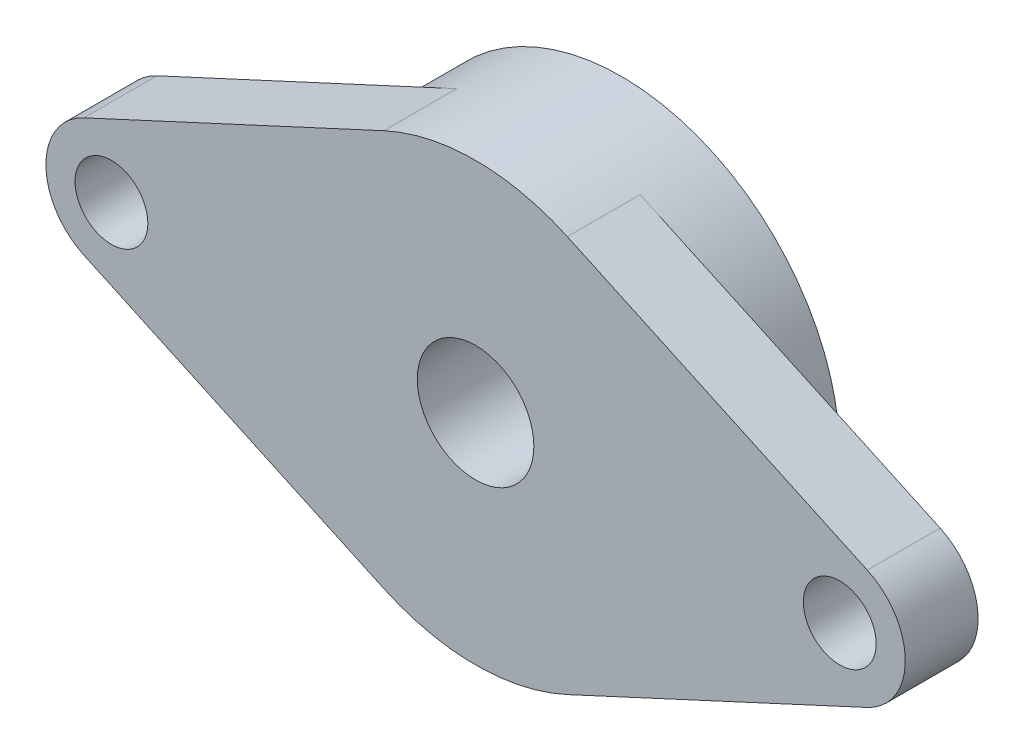
ISO-10303-21;
HEADER;
FILE_DESCRIPTION(('STEP AP214'),'2;1');
FILE_NAME('part.step','',(''),(''),'','','');
FILE_SCHEMA(('AUTOMOTIVE_DESIGN { 1 0 10303 214 1 1 1 1 }'));
ENDSEC;
DATA;
#1=APPLICATION_CONTEXT('core data for automotive mechanical design processes');
#2=APPLICATION_PROTOCOL_DEFINITION('international standard','automotive_design',2000,#1);
#3=PRODUCT_CONTEXT('',#1,'mechanical');
#4=PRODUCT('Part','Part','',(#3));
#5=PRODUCT_RELATED_PRODUCT_CATEGORY('part','',(#4));
#6=PRODUCT_DEFINITION_FORMATION('','',#4);
#7=PRODUCT_DEFINITION_CONTEXT('part definition',#1,'design');
#8=PRODUCT_DEFINITION('design','',#6,#7);
#9=PRODUCT_DEFINITION_SHAPE('','',#8);
#10=(LENGTH_UNIT() NAMED_UNIT(*) SI_UNIT(.MILLI.,.METRE.));
#11=(NAMED_UNIT(*) PLANE_ANGLE_UNIT() SI_UNIT($,.RADIAN.));
#12=(NAMED_UNIT(*) SI_UNIT($,.STERADIAN.) SOLID_ANGLE_UNIT());
#13=UNCERTAINTY_MEASURE_WITH_UNIT(LENGTH_MEASURE(1.E-05),#10,'distance_accuracy_value','');
#14=(GEOMETRIC_REPRESENTATION_CONTEXT(3) GLOBAL_UNCERTAINTY_ASSIGNED_CONTEXT((#13)) GLOBAL_UNIT_ASSIGNED_CONTEXT((#10,
#11,#12)) REPRESENTATION_CONTEXT('',''));
#15=CARTESIAN_POINT('',(0.,0.,0.));
#16=DIRECTION('',(0.,0.,1.));
#17=DIRECTION('',(1.,0.,0.));
#18=AXIS2_PLACEMENT_3D('',#15,#16,#17);
#19=CARTESIAN_POINT('',(0.,0.,0.));
#20=DIRECTION('',(0.,0.,1.));
#21=DIRECTION('',(1.,0.,0.));
#22=AXIS2_PLACEMENT_3D('',#19,#20,#21);
#23=PLANE('',#22);
#24=CARTESIAN_POINT('',(0.,0.,0.));
#25=DIRECTION('',(0.,0.,-1.));
#26=DIRECTION('',(-1.,0.,0.));
#27=AXIS2_PLACEMENT_3D('',#24,#25,#26);
#28=CIRCLE('',#27,15.);
#29=CARTESIAN_POINT('',(6.3,13.6128615654461,0.));
#30=VERTEX_POINT('',#29);
#31=CARTESIAN_POINT('',(6.3,-13.6128615654461,0.));
#32=VERTEX_POINT('',#31);
#33=EDGE_CURVE('E11',#30,#32,#28,.T.);
#34=ORIENTED_EDGE('',*,*,#33,.F.);
#35=DIRECTION('',(-0.907524104363074,0.42,0.));
#36=VECTOR('',#35,1.);
#37=CARTESIAN_POINT('',(6.3,13.6128615654461,0.));
#38=LINE('',#37,#36);
#39=CARTESIAN_POINT('',(26.89,4.08385846963383,0.));
#40=VERTEX_POINT('',#39);
#41=EDGE_CURVE('E154',#40,#30,#38,.T.);
#42=ORIENTED_EDGE('',*,*,#41,.F.);
#43=CARTESIAN_POINT('',(25.,0.,0.));
#44=DIRECTION('',(0.,0.,1.));
#45=DIRECTION('',(1.,0.,0.));
#46=AXIS2_PLACEMENT_3D('',#43,#44,#45);
#47=CIRCLE('',#46,4.5);
#48=CARTESIAN_POINT('',(26.89,-4.08385846963383,0.));
#49=VERTEX_POINT('',#48);
#50=EDGE_CURVE('E113',#40,#49,#47,.F.);
#51=ORIENTED_EDGE('',*,*,#50,.T.);
#52=DIRECTION('',(-0.907524104363074,-0.42,0.));
#53=VECTOR('',#52,1.);
#54=CARTESIAN_POINT('',(6.29999999999999,-13.6128615654461,0.));
#55=LINE('',#54,#53);
#56=EDGE_CURVE('E151',#49,#32,#55,.T.);
#57=ORIENTED_EDGE('',*,*,#56,.T.);
#58=EDGE_LOOP('',(#34,#42,#51,#57));
#59=FACE_BOUND('',#58,.T.);
#60=CARTESIAN_POINT('',(25.,0.,0.));
#61=DIRECTION('',(0.,0.,1.));
#62=DIRECTION('',(1.,0.,0.));
#63=AXIS2_PLACEMENT_3D('',#60,#61,#62);
#64=CIRCLE('',#63,2.5);
#65=CARTESIAN_POINT('',(27.5,0.,0.));
#66=VERTEX_POINT('',#65);
#67=EDGE_CURVE('E159',#66,#66,#64,.F.);
#68=ORIENTED_EDGE('',*,*,#67,.F.);
#69=EDGE_LOOP('',(#68));
#70=FACE_BOUND('',#69,.T.);
#71=ADVANCED_FACE('F35',(#59,#70),#23,.F.);
#72=CARTESIAN_POINT('',(-6.3,13.6128615654461,5.));
#73=DIRECTION('',(-0.42,0.907524104363074,0.));
#74=DIRECTION('',(-0.907524104363074,-0.42,0.));
#75=AXIS2_PLACEMENT_3D('',#72,#73,#74);
#76=PLANE('',#75);
#77=DIRECTION('',(0.907524104363074,0.42,0.));
#78=VECTOR('',#77,1.);
#79=CARTESIAN_POINT('',(-6.3,13.6128615654461,0.));
#80=LINE('',#79,#78);
#81=CARTESIAN_POINT('',(-26.89,4.08385846963383,0.));
#82=VERTEX_POINT('',#81);
#83=CARTESIAN_POINT('',(-6.3,13.6128615654461,0.));
#84=VERTEX_POINT('',#83);
#85=EDGE_CURVE('E142',#82,#84,#80,.T.);
#86=ORIENTED_EDGE('',*,*,#85,.F.);
#87=DIRECTION('',(0.,0.,-1.));
#88=VECTOR('',#87,1.);
#89=CARTESIAN_POINT('',(-26.89,4.08385846963383,5.));
#90=LINE('',#89,#88);
#91=CARTESIAN_POINT('',(-26.89,4.08385846963383,5.));
#92=VERTEX_POINT('',#91);
#93=EDGE_CURVE('E39',#92,#82,#90,.T.);
#94=ORIENTED_EDGE('',*,*,#93,.F.);
#95=DIRECTION('',(0.907524104363074,0.42,0.));
#96=VECTOR('',#95,1.);
#97=CARTESIAN_POINT('',(-6.3,13.6128615654461,5.));
#98=LINE('',#97,#96);
#99=CARTESIAN_POINT('',(-6.3,13.6128615654461,5.));
#100=VERTEX_POINT('',#99);
#101=EDGE_CURVE('E162',#92,#100,#98,.T.);
#102=ORIENTED_EDGE('',*,*,#101,.T.);
#103=DIRECTION('',(0.,0.,-1.));
#104=VECTOR('',#103,1.);
#105=CARTESIAN_POINT('',(-6.3,13.6128615654461,5.));
#106=LINE('',#105,#104);
#107=EDGE_CURVE('E141',#100,#84,#106,.T.);
#108=ORIENTED_EDGE('',*,*,#107,.T.);
#109=EDGE_LOOP('',(#86,#94,#102,#108));
#110=FACE_BOUND('',#109,.T.);
#111=ADVANCED_FACE('F37',(#110),#76,.T.);
#112=CARTESIAN_POINT('',(-25.,0.,5.));
#113=DIRECTION('',(0.,0.,-1.));
#114=DIRECTION('',(-1.,0.,0.));
#115=AXIS2_PLACEMENT_3D('',#112,#113,#114);
#116=CYLINDRICAL_SURFACE('',#115,4.5);
#117=CARTESIAN_POINT('',(-25.,0.,0.));
#118=DIRECTION('',(0.,0.,1.));
#119=DIRECTION('',(1.,0.,0.));
#120=AXIS2_PLACEMENT_3D('',#117,#118,#119);
#121=CIRCLE('',#120,4.5);
#122=CARTESIAN_POINT('',(-26.89,-4.08385846963383,0.));
#123=VERTEX_POINT('',#122);
#124=EDGE_CURVE('E145',#82,#123,#121,.T.);
#125=ORIENTED_EDGE('',*,*,#124,.T.);
#126=DIRECTION('',(0.,0.,-1.));
#127=VECTOR('',#126,1.);
#128=CARTESIAN_POINT('',(-26.89,-4.08385846963383,5.));
#129=LINE('',#128,#127);
#130=CARTESIAN_POINT('',(-26.89,-4.08385846963383,5.));
#131=VERTEX_POINT('',#130);
#132=EDGE_CURVE('E171',#131,#123,#129,.T.);
#133=ORIENTED_EDGE('',*,*,#132,.F.);
#134=CARTESIAN_POINT('',(-25.,0.,5.));
#135=DIRECTION('',(0.,0.,1.));
#136=DIRECTION('',(1.,0.,0.));
#137=AXIS2_PLACEMENT_3D('',#134,#135,#136);
#138=CIRCLE('',#137,4.5);
#139=EDGE_CURVE('E185',#92,#131,#138,.T.);
#140=ORIENTED_EDGE('',*,*,#139,.F.);
#141=ORIENTED_EDGE('',*,*,#93,.T.);
#142=EDGE_LOOP('',(#125,#133,#140,#141));
#143=FACE_BOUND('',#142,.T.);
#144=ADVANCED_FACE('F197',(#143),#116,.T.);
#145=CARTESIAN_POINT('',(-6.29999999999999,-13.6128615654461,5.));
#146=DIRECTION('',(0.42,0.907524104363074,0.));
#147=DIRECTION('',(-0.907524104363074,0.42,0.));
#148=AXIS2_PLACEMENT_3D('',#145,#146,#147);
#149=PLANE('',#148);
#150=DIRECTION('',(0.907524104363074,-0.42,0.));
#151=VECTOR('',#150,1.);
#152=CARTESIAN_POINT('',(-6.29999999999999,-13.6128615654461,0.));
#153=LINE('',#152,#151);
#154=CARTESIAN_POINT('',(-6.3,-13.6128615654461,0.));
#155=VERTEX_POINT('',#154);
#156=EDGE_CURVE('E148',#123,#155,#153,.T.);
#157=ORIENTED_EDGE('',*,*,#156,.T.);
#158=DIRECTION('',(0.,0.,-1.));
#159=VECTOR('',#158,1.);
#160=CARTESIAN_POINT('',(-6.3,-13.6128615654461,5.));
#161=LINE('',#160,#159);
#162=CARTESIAN_POINT('',(-6.3,-13.6128615654461,5.));
#163=VERTEX_POINT('',#162);
#164=EDGE_CURVE('E169',#163,#155,#161,.T.);
#165=ORIENTED_EDGE('',*,*,#164,.F.);
#166=DIRECTION('',(0.907524104363074,-0.42,0.));
#167=VECTOR('',#166,1.);
#168=CARTESIAN_POINT('',(-6.29999999999999,-13.6128615654461,5.));
#169=LINE('',#168,#167);
#170=EDGE_CURVE('E187',#131,#163,#169,.T.);
#171=ORIENTED_EDGE('',*,*,#170,.F.);
#172=ORIENTED_EDGE('',*,*,#132,.T.);
#173=EDGE_LOOP('',(#157,#165,#171,#172));
#174=FACE_BOUND('',#173,.T.);
#175=ADVANCED_FACE('F198',(#174),#149,.F.);
#176=CARTESIAN_POINT('',(6.29999999999999,-13.6128615654461,5.));
#177=DIRECTION('',(0.42,-0.907524104363074,0.));
#178=DIRECTION('',(0.907524104363074,0.42,0.));
#179=AXIS2_PLACEMENT_3D('',#176,#177,#178);
#180=PLANE('',#179);
#181=ORIENTED_EDGE('',*,*,#56,.F.);
#182=DIRECTION('',(0.,0.,-1.));
#183=VECTOR('',#182,1.);
#184=CARTESIAN_POINT('',(26.89,-4.08385846963383,5.));
#185=LINE('',#184,#183);
#186=CARTESIAN_POINT('',(26.89,-4.08385846963383,5.));
#187=VERTEX_POINT('',#186);
#188=EDGE_CURVE('E114',#187,#49,#185,.T.);
#189=ORIENTED_EDGE('',*,*,#188,.F.);
#190=DIRECTION('',(-0.907524104363074,-0.42,0.));
#191=VECTOR('',#190,1.);
#192=CARTESIAN_POINT('',(6.29999999999999,-13.6128615654461,5.));
#193=LINE('',#192,#191);
#194=CARTESIAN_POINT('',(6.3,-13.6128615654461,5.));
#195=VERTEX_POINT('',#194);
#196=EDGE_CURVE('E126',#187,#195,#193,.T.);
#197=ORIENTED_EDGE('',*,*,#196,.T.);
#198=DIRECTION('',(0.,0.,-1.));
#199=VECTOR('',#198,1.);
#200=CARTESIAN_POINT('',(6.3,-13.6128615654461,5.));
#201=LINE('',#200,#199);
#202=EDGE_CURVE('E167',#195,#32,#201,.T.);
#203=ORIENTED_EDGE('',*,*,#202,.T.);
#204=EDGE_LOOP('',(#181,#189,#197,#203));
#205=FACE_BOUND('',#204,.T.);
#206=ADVANCED_FACE('F195',(#205),#180,.T.);
#207=CARTESIAN_POINT('',(25.,0.,5.));
#208=DIRECTION('',(0.,0.,-1.));
#209=DIRECTION('',(-1.,0.,0.));
#210=AXIS2_PLACEMENT_3D('',#207,#208,#209);
#211=CYLINDRICAL_SURFACE('',#210,4.5);
#212=ORIENTED_EDGE('',*,*,#50,.F.);
#213=DIRECTION('',(0.,0.,-1.));
#214=VECTOR('',#213,1.);
#215=CARTESIAN_POINT('',(26.89,4.08385846963383,5.));
#216=LINE('',#215,#214);
#217=CARTESIAN_POINT('',(26.89,4.08385846963383,5.));
#218=VERTEX_POINT('',#217);
#219=EDGE_CURVE('E81',#218,#40,#216,.T.);
#220=ORIENTED_EDGE('',*,*,#219,.F.);
#221=CARTESIAN_POINT('',(25.,0.,5.));
#222=DIRECTION('',(0.,0.,1.));
#223=DIRECTION('',(1.,0.,0.));
#224=AXIS2_PLACEMENT_3D('',#221,#222,#223);
#225=CIRCLE('',#224,4.5);
#226=EDGE_CURVE('E111',#218,#187,#225,.F.);
#227=ORIENTED_EDGE('',*,*,#226,.T.);
#228=ORIENTED_EDGE('',*,*,#188,.T.);
#229=EDGE_LOOP('',(#212,#220,#227,#228));
#230=FACE_BOUND('',#229,.T.);
#231=ADVANCED_FACE('F109',(#230),#211,.T.);
#232=CARTESIAN_POINT('',(6.3,13.6128615654461,5.));
#233=DIRECTION('',(-0.42,-0.907524104363074,0.));
#234=DIRECTION('',(0.907524104363074,-0.42,0.));
#235=AXIS2_PLACEMENT_3D('',#232,#233,#234);
#236=PLANE('',#235);
#237=ORIENTED_EDGE('',*,*,#41,.T.);
#238=DIRECTION('',(0.,0.,-1.));
#239=VECTOR('',#238,1.);
#240=CARTESIAN_POINT('',(6.3,13.6128615654461,5.));
#241=LINE('',#240,#239);
#242=CARTESIAN_POINT('',(6.3,13.6128615654461,5.));
#243=VERTEX_POINT('',#242);
#244=EDGE_CURVE('E115',#243,#30,#241,.T.);
#245=ORIENTED_EDGE('',*,*,#244,.F.);
#246=DIRECTION('',(-0.907524104363074,0.42,0.));
#247=VECTOR('',#246,1.);
#248=CARTESIAN_POINT('',(6.3,13.6128615654461,5.));
#249=LINE('',#248,#247);
#250=EDGE_CURVE('E118',#218,#243,#249,.T.);
#251=ORIENTED_EDGE('',*,*,#250,.F.);
#252=ORIENTED_EDGE('',*,*,#219,.T.);
#253=EDGE_LOOP('',(#237,#245,#251,#252));
#254=FACE_BOUND('',#253,.T.);
#255=ADVANCED_FACE('F119',(#254),#236,.F.);
#256=CARTESIAN_POINT('',(-25.,0.,5.));
#257=DIRECTION('',(0.,0.,-1.));
#258=DIRECTION('',(-1.,0.,0.));
#259=AXIS2_PLACEMENT_3D('',#256,#257,#258);
#260=CYLINDRICAL_SURFACE('',#259,2.5);
#261=CARTESIAN_POINT('',(-25.,0.,5.));
#262=DIRECTION('',(0.,0.,1.));
#263=DIRECTION('',(1.,0.,0.));
#264=AXIS2_PLACEMENT_3D('',#261,#262,#263);
#265=CIRCLE('',#264,2.5);
#266=CARTESIAN_POINT('',(-22.5,0.,5.));
#267=VERTEX_POINT('',#266);
#268=EDGE_CURVE('E135',#267,#267,#265,.T.);
#269=ORIENTED_EDGE('',*,*,#268,.T.);
#270=EDGE_LOOP('',(#269));
#271=FACE_BOUND('',#270,.T.);
#272=CARTESIAN_POINT('',(-25.,0.,0.));
#273=DIRECTION('',(0.,0.,1.));
#274=DIRECTION('',(1.,0.,0.));
#275=AXIS2_PLACEMENT_3D('',#272,#273,#274);
#276=CIRCLE('',#275,2.5);
#277=CARTESIAN_POINT('',(-22.5,0.,0.));
#278=VERTEX_POINT('',#277);
#279=EDGE_CURVE('E156',#278,#278,#276,.T.);
#280=ORIENTED_EDGE('',*,*,#279,.F.);
#281=EDGE_LOOP('',(#280));
#282=FACE_BOUND('',#281,.T.);
#283=ADVANCED_FACE('F207',(#271,#282),#260,.F.);
#284=CARTESIAN_POINT('',(0.,0.,5.));
#285=DIRECTION('',(0.,0.,-1.));
#286=DIRECTION('',(-1.,0.,0.));
#287=AXIS2_PLACEMENT_3D('',#284,#285,#286);
#288=CYLINDRICAL_SURFACE('',#287,4.);
#289=CARTESIAN_POINT('',(0.,0.,5.));
#290=DIRECTION('',(0.,0.,1.));
#291=DIRECTION('',(1.,0.,0.));
#292=AXIS2_PLACEMENT_3D('',#289,#290,#291);
#293=CIRCLE('',#292,4.);
#294=CARTESIAN_POINT('',(4.,0.,5.));
#295=VERTEX_POINT('',#294);
#296=EDGE_CURVE('E132',#295,#295,#293,.T.);
#297=ORIENTED_EDGE('',*,*,#296,.T.);
#298=EDGE_LOOP('',(#297));
#299=FACE_BOUND('',#298,.T.);
#300=CARTESIAN_POINT('',(0.,0.,-5.));
#301=DIRECTION('',(0.,0.,-1.));
#302=DIRECTION('',(-1.,0.,0.));
#303=AXIS2_PLACEMENT_3D('',#300,#301,#302);
#304=CIRCLE('',#303,4.);
#305=CARTESIAN_POINT('',(-4.,0.,-5.));
#306=VERTEX_POINT('',#305);
#307=EDGE_CURVE('E305',#306,#306,#304,.T.);
#308=ORIENTED_EDGE('',*,*,#307,.T.);
#309=EDGE_LOOP('',(#308));
#310=FACE_BOUND('',#309,.T.);
#311=ADVANCED_FACE('F209',(#299,#310),#288,.F.);
#312=CARTESIAN_POINT('',(0.,0.,5.));
#313=DIRECTION('',(0.,0.,-1.));
#314=DIRECTION('',(-1.,0.,0.));
#315=AXIS2_PLACEMENT_3D('',#312,#313,#314);
#316=CYLINDRICAL_SURFACE('',#315,15.);
#317=ORIENTED_EDGE('',*,*,#244,.T.);
#318=ORIENTED_EDGE('',*,*,#33,.T.);
#319=ORIENTED_EDGE('',*,*,#202,.F.);
#320=CARTESIAN_POINT('',(0.,0.,5.));
#321=DIRECTION('',(0.,0.,1.));
#322=DIRECTION('',(1.,0.,0.));
#323=AXIS2_PLACEMENT_3D('',#320,#321,#322);
#324=CIRCLE('',#323,15.);
#325=EDGE_CURVE('E128',#163,#195,#324,.T.);
#326=ORIENTED_EDGE('',*,*,#325,.F.);
#327=ORIENTED_EDGE('',*,*,#164,.T.);
#328=EDGE_CURVE('E45',#155,#84,#28,.T.);
#329=ORIENTED_EDGE('',*,*,#328,.T.);
#330=ORIENTED_EDGE('',*,*,#107,.F.);
#331=EDGE_CURVE('E54',#243,#100,#324,.T.);
#332=ORIENTED_EDGE('',*,*,#331,.F.);
#333=EDGE_LOOP('',(#317,#318,#319,#326,#327,#329,#330,#332));
#334=FACE_BOUND('',#333,.T.);
#335=CARTESIAN_POINT('',(0.,0.,-5.));
#336=DIRECTION('',(0.,0.,-1.));
#337=DIRECTION('',(-1.,0.,0.));
#338=AXIS2_PLACEMENT_3D('',#335,#336,#337);
#339=CIRCLE('',#338,15.);
#340=CARTESIAN_POINT('',(-15.,0.,-5.));
#341=VERTEX_POINT('',#340);
#342=EDGE_CURVE('E146',#341,#341,#339,.T.);
#343=ORIENTED_EDGE('',*,*,#342,.F.);
#344=EDGE_LOOP('',(#343));
#345=FACE_BOUND('',#344,.T.);
#346=ADVANCED_FACE('F191',(#334,#345),#316,.T.);
#347=CARTESIAN_POINT('',(25.,0.,5.));
#348=DIRECTION('',(0.,0.,-1.));
#349=DIRECTION('',(-1.,0.,0.));
#350=AXIS2_PLACEMENT_3D('',#347,#348,#349);
#351=CYLINDRICAL_SURFACE('',#350,2.5);
#352=CARTESIAN_POINT('',(25.,0.,5.));
#353=DIRECTION('',(0.,0.,1.));
#354=DIRECTION('',(1.,0.,0.));
#355=AXIS2_PLACEMENT_3D('',#352,#353,#354);
#356=CIRCLE('',#355,2.5);
#357=CARTESIAN_POINT('',(27.5,0.,5.));
#358=VERTEX_POINT('',#357);
#359=EDGE_CURVE('E138',#358,#358,#356,.F.);
#360=ORIENTED_EDGE('',*,*,#359,.F.);
#361=EDGE_LOOP('',(#360));
#362=FACE_BOUND('',#361,.T.);
#363=ORIENTED_EDGE('',*,*,#67,.T.);
#364=EDGE_LOOP('',(#363));
#365=FACE_BOUND('',#364,.T.);
#366=ADVANCED_FACE('F226',(#362,#365),#351,.F.);
#367=CARTESIAN_POINT('',(0.,0.,5.));
#368=DIRECTION('',(0.,0.,1.));
#369=DIRECTION('',(1.,0.,0.));
#370=AXIS2_PLACEMENT_3D('',#367,#368,#369);
#371=PLANE('',#370);
#372=ORIENTED_EDGE('',*,*,#101,.F.);
#373=ORIENTED_EDGE('',*,*,#139,.T.);
#374=ORIENTED_EDGE('',*,*,#170,.T.);
#375=ORIENTED_EDGE('',*,*,#325,.T.);
#376=ORIENTED_EDGE('',*,*,#196,.F.);
#377=ORIENTED_EDGE('',*,*,#226,.F.);
#378=ORIENTED_EDGE('',*,*,#250,.T.);
#379=ORIENTED_EDGE('',*,*,#331,.T.);
#380=EDGE_LOOP('',(#372,#373,#374,#375,#376,#377,#378,#379));
#381=FACE_BOUND('',#380,.T.);
#382=ORIENTED_EDGE('',*,*,#296,.F.);
#383=EDGE_LOOP('',(#382));
#384=FACE_BOUND('',#383,.T.);
#385=ORIENTED_EDGE('',*,*,#268,.F.);
#386=EDGE_LOOP('',(#385));
#387=FACE_BOUND('',#386,.T.);
#388=ORIENTED_EDGE('',*,*,#359,.T.);
#389=EDGE_LOOP('',(#388));
#390=FACE_BOUND('',#389,.T.);
#391=ADVANCED_FACE('F123',(#381,#384,#387,#390),#371,.T.);
#392=ORIENTED_EDGE('',*,*,#328,.F.);
#393=ORIENTED_EDGE('',*,*,#156,.F.);
#394=ORIENTED_EDGE('',*,*,#124,.F.);
#395=ORIENTED_EDGE('',*,*,#85,.T.);
#396=EDGE_LOOP('',(#392,#393,#394,#395));
#397=FACE_BOUND('',#396,.T.);
#398=ORIENTED_EDGE('',*,*,#279,.T.);
#399=EDGE_LOOP('',(#398));
#400=FACE_BOUND('',#399,.T.);
#401=ADVANCED_FACE('F200',(#397,#400),#23,.F.);
#402=CARTESIAN_POINT('',(0.,0.,-5.));
#403=DIRECTION('',(0.,0.,-1.));
#404=DIRECTION('',(-1.,0.,0.));
#405=AXIS2_PLACEMENT_3D('',#402,#403,#404);
#406=PLANE('',#405);
#407=ORIENTED_EDGE('',*,*,#342,.T.);
#408=EDGE_LOOP('',(#407));
#409=FACE_BOUND('',#408,.T.);
#410=ORIENTED_EDGE('',*,*,#307,.F.);
#411=EDGE_LOOP('',(#410));
#412=FACE_BOUND('',#411,.T.);
#413=ADVANCED_FACE('F203',(#409,#412),#406,.T.);
#414=CLOSED_SHELL('',(#71,#111,#144,#175,#206,#231,#255,#283,#311,#346,#366,#391,#401,#413));
#415=MANIFOLD_SOLID_BREP('B2',#414);
#416=ADVANCED_BREP_SHAPE_REPRESENTATION('',(#18,#415),#14);
#417=SHAPE_DEFINITION_REPRESENTATION(#9,#416);
ENDSEC;
END-ISO-10303-21;
